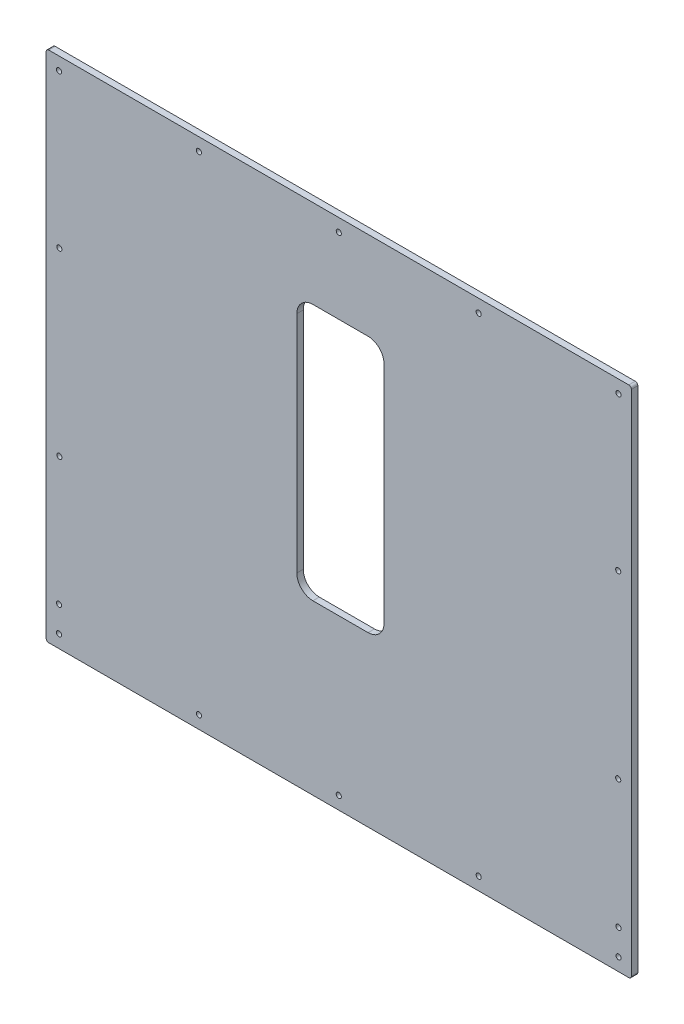
ISO-10303-21;
HEADER;
FILE_DESCRIPTION(('STEP AP214'),'2;1');
FILE_NAME('part.step','',(''),(''),'','','');
FILE_SCHEMA(('AUTOMOTIVE_DESIGN { 1 0 10303 214 1 1 1 1 }'));
ENDSEC;
DATA;
#1=APPLICATION_CONTEXT('core data for automotive mechanical design processes');
#2=APPLICATION_PROTOCOL_DEFINITION('international standard','automotive_design',2000,#1);
#3=PRODUCT_CONTEXT('',#1,'mechanical');
#4=PRODUCT('Part','Part','',(#3));
#5=PRODUCT_RELATED_PRODUCT_CATEGORY('part','',(#4));
#6=PRODUCT_DEFINITION_FORMATION('','',#4);
#7=PRODUCT_DEFINITION_CONTEXT('part definition',#1,'design');
#8=PRODUCT_DEFINITION('design','',#6,#7);
#9=PRODUCT_DEFINITION_SHAPE('','',#8);
#10=(LENGTH_UNIT() NAMED_UNIT(*) SI_UNIT(.MILLI.,.METRE.));
#11=(NAMED_UNIT(*) PLANE_ANGLE_UNIT() SI_UNIT($,.RADIAN.));
#12=(NAMED_UNIT(*) SI_UNIT($,.STERADIAN.) SOLID_ANGLE_UNIT());
#13=UNCERTAINTY_MEASURE_WITH_UNIT(LENGTH_MEASURE(1.E-05),#10,'distance_accuracy_value','');
#14=(GEOMETRIC_REPRESENTATION_CONTEXT(3) GLOBAL_UNCERTAINTY_ASSIGNED_CONTEXT((#13)) GLOBAL_UNIT_ASSIGNED_CONTEXT((#10,
#11,#12)) REPRESENTATION_CONTEXT('',''));
#15=CARTESIAN_POINT('',(0.,0.,0.));
#16=DIRECTION('',(0.,0.,1.));
#17=DIRECTION('',(1.,0.,0.));
#18=AXIS2_PLACEMENT_3D('',#15,#16,#17);
#19=CARTESIAN_POINT('',(-452.,396.,10.));
#20=DIRECTION('',(0.,0.,-1.));
#21=DIRECTION('',(-1.,0.,0.));
#22=AXIS2_PLACEMENT_3D('',#19,#20,#21);
#23=PLANE('',#22);
#24=DIRECTION('',(0.,-1.,0.));
#25=VECTOR('',#24,1.);
#26=CARTESIAN_POINT('',(-65.3796844061461,-112.501440844055,10.));
#27=LINE('',#26,#25);
#28=CARTESIAN_POINT('',(-65.3796844061461,237.498559155945,10.));
#29=VERTEX_POINT('',#28);
#30=CARTESIAN_POINT('',(-65.3796844061461,-112.501440844055,10.));
#31=VERTEX_POINT('',#30);
#32=EDGE_CURVE('E184',#29,#31,#27,.T.);
#33=ORIENTED_EDGE('',*,*,#32,.F.);
#34=CARTESIAN_POINT('',(-40.3796844061461,237.498559155945,10.));
#35=DIRECTION('',(0.,0.,1.));
#36=DIRECTION('',(1.,0.,0.));
#37=AXIS2_PLACEMENT_3D('',#34,#35,#36);
#38=CIRCLE('',#37,25.);
#39=CARTESIAN_POINT('',(-40.3796844061459,262.498559155945,10.));
#40=VERTEX_POINT('',#39);
#41=EDGE_CURVE('E47',#40,#29,#38,.T.);
#42=ORIENTED_EDGE('',*,*,#41,.F.);
#43=DIRECTION('',(-1.,0.,0.));
#44=VECTOR('',#43,1.);
#45=CARTESIAN_POINT('',(-40.3796844061459,262.498559155945,10.));
#46=LINE('',#45,#44);
#47=CARTESIAN_POINT('',(45.577215583192,262.498559155945,10.));
#48=VERTEX_POINT('',#47);
#49=EDGE_CURVE('E164',#48,#40,#46,.T.);
#50=ORIENTED_EDGE('',*,*,#49,.F.);
#51=CARTESIAN_POINT('',(45.5772155831922,237.498559155945,10.));
#52=DIRECTION('',(0.,0.,1.));
#53=DIRECTION('',(-1.,0.,0.));
#54=AXIS2_PLACEMENT_3D('',#51,#52,#53);
#55=CIRCLE('',#54,25.);
#56=CARTESIAN_POINT('',(70.5772155831922,237.498559155945,10.));
#57=VERTEX_POINT('',#56);
#58=EDGE_CURVE('E167',#57,#48,#55,.T.);
#59=ORIENTED_EDGE('',*,*,#58,.F.);
#60=DIRECTION('',(0.,1.,0.));
#61=VECTOR('',#60,1.);
#62=CARTESIAN_POINT('',(70.5772155831923,-112.501440844055,10.));
#63=LINE('',#62,#61);
#64=CARTESIAN_POINT('',(70.5772155831923,-112.501440844055,10.));
#65=VERTEX_POINT('',#64);
#66=EDGE_CURVE('E195',#65,#57,#63,.T.);
#67=ORIENTED_EDGE('',*,*,#66,.F.);
#68=CARTESIAN_POINT('',(45.5772155831923,-112.501440844055,10.));
#69=DIRECTION('',(0.,0.,1.));
#70=DIRECTION('',(-1.,0.,0.));
#71=AXIS2_PLACEMENT_3D('',#68,#69,#70);
#72=CIRCLE('',#71,25.);
#73=CARTESIAN_POINT('',(45.5772155831921,-137.501440844055,10.));
#74=VERTEX_POINT('',#73);
#75=EDGE_CURVE('E192',#74,#65,#72,.T.);
#76=ORIENTED_EDGE('',*,*,#75,.F.);
#77=DIRECTION('',(1.,0.,0.));
#78=VECTOR('',#77,1.);
#79=CARTESIAN_POINT('',(-40.3796844061459,-137.501440844055,10.));
#80=LINE('',#79,#78);
#81=CARTESIAN_POINT('',(-40.3796844061459,-137.501440844055,10.));
#82=VERTEX_POINT('',#81);
#83=EDGE_CURVE('E189',#82,#74,#80,.T.);
#84=ORIENTED_EDGE('',*,*,#83,.F.);
#85=CARTESIAN_POINT('',(-40.3796844061461,-112.501440844055,10.));
#86=DIRECTION('',(0.,0.,1.));
#87=DIRECTION('',(1.,0.,0.));
#88=AXIS2_PLACEMENT_3D('',#85,#86,#87);
#89=CIRCLE('',#88,25.);
#90=EDGE_CURVE('E186',#31,#82,#89,.T.);
#91=ORIENTED_EDGE('',*,*,#90,.F.);
#92=EDGE_LOOP('',(#33,#42,#50,#59,#67,#76,#84,#91));
#93=FACE_BOUND('',#92,.T.);
#94=CARTESIAN_POINT('',(-452.,396.,10.));
#95=DIRECTION('',(0.,0.,1.));
#96=DIRECTION('',(-1.,0.,0.));
#97=AXIS2_PLACEMENT_3D('',#94,#95,#96);
#98=CIRCLE('',#97,4.);
#99=CARTESIAN_POINT('',(-452.,400.,10.));
#100=VERTEX_POINT('',#99);
#101=CARTESIAN_POINT('',(-456.,396.,10.));
#102=VERTEX_POINT('',#101);
#103=EDGE_CURVE('E310',#100,#102,#98,.T.);
#104=ORIENTED_EDGE('',*,*,#103,.T.);
#105=DIRECTION('',(0.,-1.,0.));
#106=VECTOR('',#105,1.);
#107=CARTESIAN_POINT('',(-456.,-396.,10.));
#108=LINE('',#107,#106);
#109=CARTESIAN_POINT('',(-456.,-396.,10.));
#110=VERTEX_POINT('',#109);
#111=EDGE_CURVE('E313',#102,#110,#108,.T.);
#112=ORIENTED_EDGE('',*,*,#111,.T.);
#113=CARTESIAN_POINT('',(-452.,-396.,10.));
#114=DIRECTION('',(0.,0.,1.));
#115=DIRECTION('',(1.,0.,0.));
#116=AXIS2_PLACEMENT_3D('',#113,#114,#115);
#117=CIRCLE('',#116,4.);
#118=CARTESIAN_POINT('',(-452.,-400.,10.));
#119=VERTEX_POINT('',#118);
#120=EDGE_CURVE('E316',#110,#119,#117,.T.);
#121=ORIENTED_EDGE('',*,*,#120,.T.);
#122=DIRECTION('',(1.,0.,0.));
#123=VECTOR('',#122,1.);
#124=CARTESIAN_POINT('',(-452.,-400.,10.));
#125=LINE('',#124,#123);
#126=CARTESIAN_POINT('',(452.,-400.,10.));
#127=VERTEX_POINT('',#126);
#128=EDGE_CURVE('E318',#119,#127,#125,.T.);
#129=ORIENTED_EDGE('',*,*,#128,.T.);
#130=CARTESIAN_POINT('',(452.,-396.,10.));
#131=DIRECTION('',(0.,0.,1.));
#132=DIRECTION('',(1.,0.,0.));
#133=AXIS2_PLACEMENT_3D('',#130,#131,#132);
#134=CIRCLE('',#133,4.);
#135=CARTESIAN_POINT('',(456.,-396.,10.));
#136=VERTEX_POINT('',#135);
#137=EDGE_CURVE('E320',#127,#136,#134,.T.);
#138=ORIENTED_EDGE('',*,*,#137,.T.);
#139=DIRECTION('',(0.,1.,0.));
#140=VECTOR('',#139,1.);
#141=CARTESIAN_POINT('',(456.,-396.,10.));
#142=LINE('',#141,#140);
#143=CARTESIAN_POINT('',(456.,396.,10.));
#144=VERTEX_POINT('',#143);
#145=EDGE_CURVE('E322',#136,#144,#142,.T.);
#146=ORIENTED_EDGE('',*,*,#145,.T.);
#147=CARTESIAN_POINT('',(452.,396.,10.));
#148=DIRECTION('',(0.,0.,1.));
#149=DIRECTION('',(1.,0.,0.));
#150=AXIS2_PLACEMENT_3D('',#147,#148,#149);
#151=CIRCLE('',#150,4.);
#152=CARTESIAN_POINT('',(452.,400.,10.));
#153=VERTEX_POINT('',#152);
#154=EDGE_CURVE('E324',#144,#153,#151,.T.);
#155=ORIENTED_EDGE('',*,*,#154,.T.);
#156=DIRECTION('',(-1.,0.,0.));
#157=VECTOR('',#156,1.);
#158=CARTESIAN_POINT('',(-452.,400.,10.));
#159=LINE('',#158,#157);
#160=EDGE_CURVE('E326',#153,#100,#159,.T.);
#161=ORIENTED_EDGE('',*,*,#160,.T.);
#162=EDGE_LOOP('',(#104,#112,#121,#129,#138,#146,#155,#161));
#163=FACE_BOUND('',#162,.T.);
#164=CARTESIAN_POINT('',(436.,380.,10.));
#165=DIRECTION('',(0.,0.,1.));
#166=DIRECTION('',(1.,0.,0.));
#167=AXIS2_PLACEMENT_3D('',#164,#165,#166);
#168=CIRCLE('',#167,3.99999999999999);
#169=CARTESIAN_POINT('',(440.,380.,10.));
#170=VERTEX_POINT('',#169);
#171=EDGE_CURVE('E304',#170,#170,#168,.T.);
#172=ORIENTED_EDGE('',*,*,#171,.F.);
#173=EDGE_LOOP('',(#172));
#174=FACE_BOUND('',#173,.T.);
#175=CARTESIAN_POINT('',(435.5,141.,10.));
#176=DIRECTION('',(0.,0.,1.));
#177=DIRECTION('',(1.,0.,0.));
#178=AXIS2_PLACEMENT_3D('',#175,#176,#177);
#179=CIRCLE('',#178,3.99999999999999);
#180=CARTESIAN_POINT('',(439.5,141.,10.));
#181=VERTEX_POINT('',#180);
#182=EDGE_CURVE('E298',#181,#181,#179,.T.);
#183=ORIENTED_EDGE('',*,*,#182,.F.);
#184=EDGE_LOOP('',(#183));
#185=FACE_BOUND('',#184,.T.);
#186=CARTESIAN_POINT('',(435.500000000003,-140.,10.));
#187=DIRECTION('',(0.,0.,1.));
#188=DIRECTION('',(1.,0.,0.));
#189=AXIS2_PLACEMENT_3D('',#186,#187,#188);
#190=CIRCLE('',#189,3.99999999999999);
#191=CARTESIAN_POINT('',(439.500000000003,-140.,10.));
#192=VERTEX_POINT('',#191);
#193=EDGE_CURVE('E292',#192,#192,#190,.T.);
#194=ORIENTED_EDGE('',*,*,#193,.F.);
#195=EDGE_LOOP('',(#194));
#196=FACE_BOUND('',#195,.T.);
#197=CARTESIAN_POINT('',(-435.500000000003,-140.,10.));
#198=DIRECTION('',(0.,0.,1.));
#199=DIRECTION('',(-1.,0.,0.));
#200=AXIS2_PLACEMENT_3D('',#197,#198,#199);
#201=CIRCLE('',#200,3.99999999999999);
#202=CARTESIAN_POINT('',(-439.500000000003,-140.,10.));
#203=VERTEX_POINT('',#202);
#204=EDGE_CURVE('E286',#203,#203,#201,.T.);
#205=ORIENTED_EDGE('',*,*,#204,.F.);
#206=EDGE_LOOP('',(#205));
#207=FACE_BOUND('',#206,.T.);
#208=CARTESIAN_POINT('',(-436.,380.,10.));
#209=DIRECTION('',(0.,0.,1.));
#210=DIRECTION('',(-1.,0.,0.));
#211=AXIS2_PLACEMENT_3D('',#208,#209,#210);
#212=CIRCLE('',#211,3.99999999999999);
#213=CARTESIAN_POINT('',(-440.,380.,10.));
#214=VERTEX_POINT('',#213);
#215=EDGE_CURVE('E280',#214,#214,#212,.T.);
#216=ORIENTED_EDGE('',*,*,#215,.F.);
#217=EDGE_LOOP('',(#216));
#218=FACE_BOUND('',#217,.T.);
#219=CARTESIAN_POINT('',(-435.5,141.,10.));
#220=DIRECTION('',(0.,0.,1.));
#221=DIRECTION('',(-1.,0.,0.));
#222=AXIS2_PLACEMENT_3D('',#219,#220,#221);
#223=CIRCLE('',#222,3.99999999999999);
#224=CARTESIAN_POINT('',(-439.5,141.,10.));
#225=VERTEX_POINT('',#224);
#226=EDGE_CURVE('E274',#225,#225,#223,.T.);
#227=ORIENTED_EDGE('',*,*,#226,.F.);
#228=EDGE_LOOP('',(#227));
#229=FACE_BOUND('',#228,.T.);
#230=CARTESIAN_POINT('',(436.,-380.,10.));
#231=DIRECTION('',(0.,0.,1.));
#232=DIRECTION('',(-1.,0.,0.));
#233=AXIS2_PLACEMENT_3D('',#230,#231,#232);
#234=CIRCLE('',#233,3.99999999999999);
#235=CARTESIAN_POINT('',(432.,-380.,10.));
#236=VERTEX_POINT('',#235);
#237=EDGE_CURVE('E268',#236,#236,#234,.T.);
#238=ORIENTED_EDGE('',*,*,#237,.F.);
#239=EDGE_LOOP('',(#238));
#240=FACE_BOUND('',#239,.T.);
#241=CARTESIAN_POINT('',(436.,-340.,10.));
#242=DIRECTION('',(0.,0.,1.));
#243=DIRECTION('',(-1.,0.,0.));
#244=AXIS2_PLACEMENT_3D('',#241,#242,#243);
#245=CIRCLE('',#244,3.99999999999999);
#246=CARTESIAN_POINT('',(432.,-340.,10.));
#247=VERTEX_POINT('',#246);
#248=EDGE_CURVE('E262',#247,#247,#245,.T.);
#249=ORIENTED_EDGE('',*,*,#248,.F.);
#250=EDGE_LOOP('',(#249));
#251=FACE_BOUND('',#250,.T.);
#252=CARTESIAN_POINT('',(-435.999999999999,-340.,10.));
#253=DIRECTION('',(0.,0.,1.));
#254=DIRECTION('',(1.,0.,0.));
#255=AXIS2_PLACEMENT_3D('',#252,#253,#254);
#256=CIRCLE('',#255,3.99999999999999);
#257=CARTESIAN_POINT('',(-431.999999999999,-340.,10.));
#258=VERTEX_POINT('',#257);
#259=EDGE_CURVE('E256',#258,#258,#256,.T.);
#260=ORIENTED_EDGE('',*,*,#259,.F.);
#261=EDGE_LOOP('',(#260));
#262=FACE_BOUND('',#261,.T.);
#263=CARTESIAN_POINT('',(-435.999999999999,-380.,10.));
#264=DIRECTION('',(0.,0.,1.));
#265=DIRECTION('',(1.,0.,0.));
#266=AXIS2_PLACEMENT_3D('',#263,#264,#265);
#267=CIRCLE('',#266,3.99999999999999);
#268=CARTESIAN_POINT('',(-431.999999999999,-380.,10.));
#269=VERTEX_POINT('',#268);
#270=EDGE_CURVE('E250',#269,#269,#267,.T.);
#271=ORIENTED_EDGE('',*,*,#270,.F.);
#272=EDGE_LOOP('',(#271));
#273=FACE_BOUND('',#272,.T.);
#274=CARTESIAN_POINT('',(-218.,380.000000000005,10.));
#275=DIRECTION('',(0.,0.,1.));
#276=DIRECTION('',(1.,0.,0.));
#277=AXIS2_PLACEMENT_3D('',#274,#275,#276);
#278=CIRCLE('',#277,3.99999999999999);
#279=CARTESIAN_POINT('',(-214.,380.000000000005,10.));
#280=VERTEX_POINT('',#279);
#281=EDGE_CURVE('E244',#280,#280,#278,.T.);
#282=ORIENTED_EDGE('',*,*,#281,.F.);
#283=EDGE_LOOP('',(#282));
#284=FACE_BOUND('',#283,.T.);
#285=CARTESIAN_POINT('',(218.,-380.000000000002,10.));
#286=DIRECTION('',(0.,0.,1.));
#287=DIRECTION('',(-1.,0.,0.));
#288=AXIS2_PLACEMENT_3D('',#285,#286,#287);
#289=CIRCLE('',#288,3.99999999999999);
#290=CARTESIAN_POINT('',(214.,-380.000000000002,10.));
#291=VERTEX_POINT('',#290);
#292=EDGE_CURVE('E238',#291,#291,#289,.T.);
#293=ORIENTED_EDGE('',*,*,#292,.F.);
#294=EDGE_LOOP('',(#293));
#295=FACE_BOUND('',#294,.T.);
#296=CARTESIAN_POINT('',(-2.22044604925031E-13,-380.000000000003,10.));
#297=DIRECTION('',(0.,0.,1.));
#298=DIRECTION('',(-1.,0.,0.));
#299=AXIS2_PLACEMENT_3D('',#296,#297,#298);
#300=CIRCLE('',#299,3.99999999999999);
#301=CARTESIAN_POINT('',(-4.00000000000021,-380.000000000003,10.));
#302=VERTEX_POINT('',#301);
#303=EDGE_CURVE('E232',#302,#302,#300,.T.);
#304=ORIENTED_EDGE('',*,*,#303,.F.);
#305=EDGE_LOOP('',(#304));
#306=FACE_BOUND('',#305,.T.);
#307=CARTESIAN_POINT('',(-218.,-380.000000000005,10.));
#308=DIRECTION('',(0.,0.,1.));
#309=DIRECTION('',(-1.,0.,0.));
#310=AXIS2_PLACEMENT_3D('',#307,#308,#309);
#311=CIRCLE('',#310,3.99999999999999);
#312=CARTESIAN_POINT('',(-222.,-380.000000000005,10.));
#313=VERTEX_POINT('',#312);
#314=EDGE_CURVE('E226',#313,#313,#311,.T.);
#315=ORIENTED_EDGE('',*,*,#314,.F.);
#316=EDGE_LOOP('',(#315));
#317=FACE_BOUND('',#316,.T.);
#318=CARTESIAN_POINT('',(-4.44089209850063E-13,380.000000000003,10.));
#319=DIRECTION('',(0.,0.,1.));
#320=DIRECTION('',(1.,0.,0.));
#321=AXIS2_PLACEMENT_3D('',#318,#319,#320);
#322=CIRCLE('',#321,3.99999999999999);
#323=CARTESIAN_POINT('',(3.99999999999955,380.000000000003,10.));
#324=VERTEX_POINT('',#323);
#325=EDGE_CURVE('E220',#324,#324,#322,.T.);
#326=ORIENTED_EDGE('',*,*,#325,.F.);
#327=EDGE_LOOP('',(#326));
#328=FACE_BOUND('',#327,.T.);
#329=CARTESIAN_POINT('',(217.999999999999,380.000000000002,10.));
#330=DIRECTION('',(0.,0.,1.));
#331=DIRECTION('',(1.,0.,0.));
#332=AXIS2_PLACEMENT_3D('',#329,#330,#331);
#333=CIRCLE('',#332,3.99999999999999);
#334=CARTESIAN_POINT('',(221.999999999999,380.000000000002,10.));
#335=VERTEX_POINT('',#334);
#336=EDGE_CURVE('E214',#335,#335,#333,.T.);
#337=ORIENTED_EDGE('',*,*,#336,.F.);
#338=EDGE_LOOP('',(#337));
#339=FACE_BOUND('',#338,.T.);
#340=ADVANCED_FACE('F32',(#93,#163,#174,#185,#196,#207,#218,#229,#240,#251,#262,#273,#284,#295,
#306,#317,#328,#339),#23,.F.);
#341=CARTESIAN_POINT('',(-452.,396.,0.));
#342=DIRECTION('',(0.,0.,-1.));
#343=DIRECTION('',(-1.,0.,0.));
#344=AXIS2_PLACEMENT_3D('',#341,#342,#343);
#345=PLANE('',#344);
#346=CARTESIAN_POINT('',(-40.3796844061461,237.498559155945,0.));
#347=DIRECTION('',(0.,0.,1.));
#348=DIRECTION('',(1.,0.,0.));
#349=AXIS2_PLACEMENT_3D('',#346,#347,#348);
#350=CIRCLE('',#349,25.);
#351=CARTESIAN_POINT('',(-40.3796844061459,262.498559155945,0.));
#352=VERTEX_POINT('',#351);
#353=CARTESIAN_POINT('',(-65.3796844061461,237.498559155945,0.));
#354=VERTEX_POINT('',#353);
#355=EDGE_CURVE('E147',#352,#354,#350,.T.);
#356=ORIENTED_EDGE('',*,*,#355,.T.);
#357=DIRECTION('',(0.,-1.,0.));
#358=VECTOR('',#357,1.);
#359=CARTESIAN_POINT('',(-65.3796844061461,-112.501440844055,0.));
#360=LINE('',#359,#358);
#361=CARTESIAN_POINT('',(-65.3796844061461,-112.501440844055,0.));
#362=VERTEX_POINT('',#361);
#363=EDGE_CURVE('E156',#354,#362,#360,.T.);
#364=ORIENTED_EDGE('',*,*,#363,.T.);
#365=CARTESIAN_POINT('',(-40.3796844061461,-112.501440844055,0.));
#366=DIRECTION('',(0.,0.,1.));
#367=DIRECTION('',(1.,0.,0.));
#368=AXIS2_PLACEMENT_3D('',#365,#366,#367);
#369=CIRCLE('',#368,25.);
#370=CARTESIAN_POINT('',(-40.3796844061459,-137.501440844055,0.));
#371=VERTEX_POINT('',#370);
#372=EDGE_CURVE('E55',#362,#371,#369,.T.);
#373=ORIENTED_EDGE('',*,*,#372,.T.);
#374=DIRECTION('',(1.,0.,0.));
#375=VECTOR('',#374,1.);
#376=CARTESIAN_POINT('',(-40.3796844061459,-137.501440844055,0.));
#377=LINE('',#376,#375);
#378=CARTESIAN_POINT('',(45.5772155831921,-137.501440844055,0.));
#379=VERTEX_POINT('',#378);
#380=EDGE_CURVE('E171',#371,#379,#377,.T.);
#381=ORIENTED_EDGE('',*,*,#380,.T.);
#382=CARTESIAN_POINT('',(45.5772155831923,-112.501440844055,0.));
#383=DIRECTION('',(0.,0.,1.));
#384=DIRECTION('',(-1.,0.,0.));
#385=AXIS2_PLACEMENT_3D('',#382,#383,#384);
#386=CIRCLE('',#385,25.);
#387=CARTESIAN_POINT('',(70.5772155831923,-112.501440844055,0.));
#388=VERTEX_POINT('',#387);
#389=EDGE_CURVE('E174',#379,#388,#386,.T.);
#390=ORIENTED_EDGE('',*,*,#389,.T.);
#391=DIRECTION('',(0.,1.,0.));
#392=VECTOR('',#391,1.);
#393=CARTESIAN_POINT('',(70.5772155831923,-112.501440844055,0.));
#394=LINE('',#393,#392);
#395=CARTESIAN_POINT('',(70.5772155831922,237.498559155945,0.));
#396=VERTEX_POINT('',#395);
#397=EDGE_CURVE('E177',#388,#396,#394,.T.);
#398=ORIENTED_EDGE('',*,*,#397,.T.);
#399=CARTESIAN_POINT('',(45.5772155831922,237.498559155945,0.));
#400=DIRECTION('',(0.,0.,1.));
#401=DIRECTION('',(-1.,0.,0.));
#402=AXIS2_PLACEMENT_3D('',#399,#400,#401);
#403=CIRCLE('',#402,25.);
#404=CARTESIAN_POINT('',(45.577215583192,262.498559155945,0.));
#405=VERTEX_POINT('',#404);
#406=EDGE_CURVE('E180',#396,#405,#403,.T.);
#407=ORIENTED_EDGE('',*,*,#406,.T.);
#408=DIRECTION('',(-1.,0.,0.));
#409=VECTOR('',#408,1.);
#410=CARTESIAN_POINT('',(-40.3796844061459,262.498559155945,0.));
#411=LINE('',#410,#409);
#412=EDGE_CURVE('E153',#405,#352,#411,.T.);
#413=ORIENTED_EDGE('',*,*,#412,.T.);
#414=EDGE_LOOP('',(#356,#364,#373,#381,#390,#398,#407,#413));
#415=FACE_BOUND('',#414,.T.);
#416=CARTESIAN_POINT('',(-4.44089209850063E-13,380.000000000003,0.));
#417=DIRECTION('',(0.,0.,1.));
#418=DIRECTION('',(1.,0.,0.));
#419=AXIS2_PLACEMENT_3D('',#416,#417,#418);
#420=CIRCLE('',#419,3.99999999999999);
#421=CARTESIAN_POINT('',(3.99999999999955,380.000000000003,0.));
#422=VERTEX_POINT('',#421);
#423=EDGE_CURVE('E217',#422,#422,#420,.T.);
#424=ORIENTED_EDGE('',*,*,#423,.T.);
#425=EDGE_LOOP('',(#424));
#426=FACE_BOUND('',#425,.T.);
#427=CARTESIAN_POINT('',(-2.22044604925031E-13,-380.000000000003,0.));
#428=DIRECTION('',(0.,0.,1.));
#429=DIRECTION('',(-1.,0.,0.));
#430=AXIS2_PLACEMENT_3D('',#427,#428,#429);
#431=CIRCLE('',#430,3.99999999999999);
#432=CARTESIAN_POINT('',(-4.00000000000021,-380.000000000003,0.));
#433=VERTEX_POINT('',#432);
#434=EDGE_CURVE('E229',#433,#433,#431,.T.);
#435=ORIENTED_EDGE('',*,*,#434,.T.);
#436=EDGE_LOOP('',(#435));
#437=FACE_BOUND('',#436,.T.);
#438=CARTESIAN_POINT('',(-218.,380.000000000005,0.));
#439=DIRECTION('',(0.,0.,1.));
#440=DIRECTION('',(1.,0.,0.));
#441=AXIS2_PLACEMENT_3D('',#438,#439,#440);
#442=CIRCLE('',#441,3.99999999999999);
#443=CARTESIAN_POINT('',(-214.,380.000000000005,0.));
#444=VERTEX_POINT('',#443);
#445=EDGE_CURVE('E241',#444,#444,#442,.T.);
#446=ORIENTED_EDGE('',*,*,#445,.T.);
#447=EDGE_LOOP('',(#446));
#448=FACE_BOUND('',#447,.T.);
#449=CARTESIAN_POINT('',(-435.999999999999,-340.,0.));
#450=DIRECTION('',(0.,0.,1.));
#451=DIRECTION('',(1.,0.,0.));
#452=AXIS2_PLACEMENT_3D('',#449,#450,#451);
#453=CIRCLE('',#452,3.99999999999999);
#454=CARTESIAN_POINT('',(-431.999999999999,-340.,0.));
#455=VERTEX_POINT('',#454);
#456=EDGE_CURVE('E253',#455,#455,#453,.T.);
#457=ORIENTED_EDGE('',*,*,#456,.T.);
#458=EDGE_LOOP('',(#457));
#459=FACE_BOUND('',#458,.T.);
#460=CARTESIAN_POINT('',(436.,-380.,0.));
#461=DIRECTION('',(0.,0.,1.));
#462=DIRECTION('',(-1.,0.,0.));
#463=AXIS2_PLACEMENT_3D('',#460,#461,#462);
#464=CIRCLE('',#463,3.99999999999999);
#465=CARTESIAN_POINT('',(432.,-380.,0.));
#466=VERTEX_POINT('',#465);
#467=EDGE_CURVE('E265',#466,#466,#464,.T.);
#468=ORIENTED_EDGE('',*,*,#467,.T.);
#469=EDGE_LOOP('',(#468));
#470=FACE_BOUND('',#469,.T.);
#471=CARTESIAN_POINT('',(-436.,380.,0.));
#472=DIRECTION('',(0.,0.,1.));
#473=DIRECTION('',(-1.,0.,0.));
#474=AXIS2_PLACEMENT_3D('',#471,#472,#473);
#475=CIRCLE('',#474,3.99999999999999);
#476=CARTESIAN_POINT('',(-440.,380.,0.));
#477=VERTEX_POINT('',#476);
#478=EDGE_CURVE('E277',#477,#477,#475,.T.);
#479=ORIENTED_EDGE('',*,*,#478,.T.);
#480=EDGE_LOOP('',(#479));
#481=FACE_BOUND('',#480,.T.);
#482=CARTESIAN_POINT('',(435.500000000003,-140.,0.));
#483=DIRECTION('',(0.,0.,1.));
#484=DIRECTION('',(1.,0.,0.));
#485=AXIS2_PLACEMENT_3D('',#482,#483,#484);
#486=CIRCLE('',#485,3.99999999999999);
#487=CARTESIAN_POINT('',(439.500000000003,-140.,0.));
#488=VERTEX_POINT('',#487);
#489=EDGE_CURVE('E289',#488,#488,#486,.T.);
#490=ORIENTED_EDGE('',*,*,#489,.T.);
#491=EDGE_LOOP('',(#490));
#492=FACE_BOUND('',#491,.T.);
#493=CARTESIAN_POINT('',(436.,380.,0.));
#494=DIRECTION('',(0.,0.,1.));
#495=DIRECTION('',(1.,0.,0.));
#496=AXIS2_PLACEMENT_3D('',#493,#494,#495);
#497=CIRCLE('',#496,3.99999999999999);
#498=CARTESIAN_POINT('',(440.,380.,0.));
#499=VERTEX_POINT('',#498);
#500=EDGE_CURVE('E301',#499,#499,#497,.T.);
#501=ORIENTED_EDGE('',*,*,#500,.T.);
#502=EDGE_LOOP('',(#501));
#503=FACE_BOUND('',#502,.T.);
#504=CARTESIAN_POINT('',(-452.,396.,0.));
#505=DIRECTION('',(0.,0.,1.));
#506=DIRECTION('',(-1.,0.,0.));
#507=AXIS2_PLACEMENT_3D('',#504,#505,#506);
#508=CIRCLE('',#507,4.);
#509=CARTESIAN_POINT('',(-452.,400.,0.));
#510=VERTEX_POINT('',#509);
#511=CARTESIAN_POINT('',(-456.,396.,0.));
#512=VERTEX_POINT('',#511);
#513=EDGE_CURVE('E307',#510,#512,#508,.T.);
#514=ORIENTED_EDGE('',*,*,#513,.F.);
#515=DIRECTION('',(-1.,0.,0.));
#516=VECTOR('',#515,1.);
#517=CARTESIAN_POINT('',(-452.,400.,0.));
#518=LINE('',#517,#516);
#519=CARTESIAN_POINT('',(452.,400.,0.));
#520=VERTEX_POINT('',#519);
#521=EDGE_CURVE('E314',#520,#510,#518,.T.);
#522=ORIENTED_EDGE('',*,*,#521,.F.);
#523=CARTESIAN_POINT('',(452.,396.,0.));
#524=DIRECTION('',(0.,0.,1.));
#525=DIRECTION('',(1.,0.,0.));
#526=AXIS2_PLACEMENT_3D('',#523,#524,#525);
#527=CIRCLE('',#526,4.);
#528=CARTESIAN_POINT('',(456.,396.,0.));
#529=VERTEX_POINT('',#528);
#530=EDGE_CURVE('E341',#529,#520,#527,.T.);
#531=ORIENTED_EDGE('',*,*,#530,.F.);
#532=DIRECTION('',(0.,1.,0.));
#533=VECTOR('',#532,1.);
#534=CARTESIAN_POINT('',(456.,-396.,0.));
#535=LINE('',#534,#533);
#536=CARTESIAN_POINT('',(456.,-396.,0.));
#537=VERTEX_POINT('',#536);
#538=EDGE_CURVE('E339',#537,#529,#535,.T.);
#539=ORIENTED_EDGE('',*,*,#538,.F.);
#540=CARTESIAN_POINT('',(452.,-396.,0.));
#541=DIRECTION('',(0.,0.,1.));
#542=DIRECTION('',(1.,0.,0.));
#543=AXIS2_PLACEMENT_3D('',#540,#541,#542);
#544=CIRCLE('',#543,4.);
#545=CARTESIAN_POINT('',(452.,-400.,0.));
#546=VERTEX_POINT('',#545);
#547=EDGE_CURVE('E337',#546,#537,#544,.T.);
#548=ORIENTED_EDGE('',*,*,#547,.F.);
#549=DIRECTION('',(1.,0.,0.));
#550=VECTOR('',#549,1.);
#551=CARTESIAN_POINT('',(-452.,-400.,0.));
#552=LINE('',#551,#550);
#553=CARTESIAN_POINT('',(-452.,-400.,0.));
#554=VERTEX_POINT('',#553);
#555=EDGE_CURVE('E335',#554,#546,#552,.T.);
#556=ORIENTED_EDGE('',*,*,#555,.F.);
#557=CARTESIAN_POINT('',(-452.,-396.,0.));
#558=DIRECTION('',(0.,0.,1.));
#559=DIRECTION('',(1.,0.,0.));
#560=AXIS2_PLACEMENT_3D('',#557,#558,#559);
#561=CIRCLE('',#560,4.);
#562=CARTESIAN_POINT('',(-456.,-396.,0.));
#563=VERTEX_POINT('',#562);
#564=EDGE_CURVE('E333',#563,#554,#561,.T.);
#565=ORIENTED_EDGE('',*,*,#564,.F.);
#566=DIRECTION('',(0.,-1.,0.));
#567=VECTOR('',#566,1.);
#568=CARTESIAN_POINT('',(-456.,-396.,0.));
#569=LINE('',#568,#567);
#570=EDGE_CURVE('E331',#512,#563,#569,.T.);
#571=ORIENTED_EDGE('',*,*,#570,.F.);
#572=EDGE_LOOP('',(#514,#522,#531,#539,#548,#556,#565,#571));
#573=FACE_BOUND('',#572,.T.);
#574=CARTESIAN_POINT('',(435.5,141.,0.));
#575=DIRECTION('',(0.,0.,1.));
#576=DIRECTION('',(1.,0.,0.));
#577=AXIS2_PLACEMENT_3D('',#574,#575,#576);
#578=CIRCLE('',#577,3.99999999999999);
#579=CARTESIAN_POINT('',(439.5,141.,0.));
#580=VERTEX_POINT('',#579);
#581=EDGE_CURVE('E295',#580,#580,#578,.T.);
#582=ORIENTED_EDGE('',*,*,#581,.T.);
#583=EDGE_LOOP('',(#582));
#584=FACE_BOUND('',#583,.T.);
#585=CARTESIAN_POINT('',(-435.500000000003,-140.,0.));
#586=DIRECTION('',(0.,0.,1.));
#587=DIRECTION('',(-1.,0.,0.));
#588=AXIS2_PLACEMENT_3D('',#585,#586,#587);
#589=CIRCLE('',#588,3.99999999999999);
#590=CARTESIAN_POINT('',(-439.500000000003,-140.,0.));
#591=VERTEX_POINT('',#590);
#592=EDGE_CURVE('E283',#591,#591,#589,.T.);
#593=ORIENTED_EDGE('',*,*,#592,.T.);
#594=EDGE_LOOP('',(#593));
#595=FACE_BOUND('',#594,.T.);
#596=CARTESIAN_POINT('',(-435.5,141.,0.));
#597=DIRECTION('',(0.,0.,1.));
#598=DIRECTION('',(-1.,0.,0.));
#599=AXIS2_PLACEMENT_3D('',#596,#597,#598);
#600=CIRCLE('',#599,3.99999999999999);
#601=CARTESIAN_POINT('',(-439.5,141.,0.));
#602=VERTEX_POINT('',#601);
#603=EDGE_CURVE('E271',#602,#602,#600,.T.);
#604=ORIENTED_EDGE('',*,*,#603,.T.);
#605=EDGE_LOOP('',(#604));
#606=FACE_BOUND('',#605,.T.);
#607=CARTESIAN_POINT('',(436.,-340.,0.));
#608=DIRECTION('',(0.,0.,1.));
#609=DIRECTION('',(-1.,0.,0.));
#610=AXIS2_PLACEMENT_3D('',#607,#608,#609);
#611=CIRCLE('',#610,3.99999999999999);
#612=CARTESIAN_POINT('',(432.,-340.,0.));
#613=VERTEX_POINT('',#612);
#614=EDGE_CURVE('E259',#613,#613,#611,.T.);
#615=ORIENTED_EDGE('',*,*,#614,.T.);
#616=EDGE_LOOP('',(#615));
#617=FACE_BOUND('',#616,.T.);
#618=CARTESIAN_POINT('',(-435.999999999999,-380.,0.));
#619=DIRECTION('',(0.,0.,1.));
#620=DIRECTION('',(1.,0.,0.));
#621=AXIS2_PLACEMENT_3D('',#618,#619,#620);
#622=CIRCLE('',#621,3.99999999999999);
#623=CARTESIAN_POINT('',(-431.999999999999,-380.,0.));
#624=VERTEX_POINT('',#623);
#625=EDGE_CURVE('E247',#624,#624,#622,.T.);
#626=ORIENTED_EDGE('',*,*,#625,.T.);
#627=EDGE_LOOP('',(#626));
#628=FACE_BOUND('',#627,.T.);
#629=CARTESIAN_POINT('',(218.,-380.000000000002,0.));
#630=DIRECTION('',(0.,0.,1.));
#631=DIRECTION('',(-1.,0.,0.));
#632=AXIS2_PLACEMENT_3D('',#629,#630,#631);
#633=CIRCLE('',#632,3.99999999999999);
#634=CARTESIAN_POINT('',(214.,-380.000000000002,0.));
#635=VERTEX_POINT('',#634);
#636=EDGE_CURVE('E235',#635,#635,#633,.T.);
#637=ORIENTED_EDGE('',*,*,#636,.T.);
#638=EDGE_LOOP('',(#637));
#639=FACE_BOUND('',#638,.T.);
#640=CARTESIAN_POINT('',(-218.,-380.000000000005,0.));
#641=DIRECTION('',(0.,0.,1.));
#642=DIRECTION('',(-1.,0.,0.));
#643=AXIS2_PLACEMENT_3D('',#640,#641,#642);
#644=CIRCLE('',#643,3.99999999999999);
#645=CARTESIAN_POINT('',(-222.,-380.000000000005,0.));
#646=VERTEX_POINT('',#645);
#647=EDGE_CURVE('E223',#646,#646,#644,.T.);
#648=ORIENTED_EDGE('',*,*,#647,.T.);
#649=EDGE_LOOP('',(#648));
#650=FACE_BOUND('',#649,.T.);
#651=CARTESIAN_POINT('',(217.999999999999,380.000000000002,0.));
#652=DIRECTION('',(0.,0.,1.));
#653=DIRECTION('',(1.,0.,0.));
#654=AXIS2_PLACEMENT_3D('',#651,#652,#653);
#655=CIRCLE('',#654,3.99999999999999);
#656=CARTESIAN_POINT('',(221.999999999999,380.000000000002,0.));
#657=VERTEX_POINT('',#656);
#658=EDGE_CURVE('E202',#657,#657,#655,.T.);
#659=ORIENTED_EDGE('',*,*,#658,.T.);
#660=EDGE_LOOP('',(#659));
#661=FACE_BOUND('',#660,.T.);
#662=ADVANCED_FACE('F160',(#415,#426,#437,#448,#459,#470,#481,#492,#503,#573,#584,#595,#606,
#617,#628,#639,#650,#661),#345,.T.);
#663=CARTESIAN_POINT('',(-452.,396.,10.));
#664=DIRECTION('',(0.,0.,-1.));
#665=DIRECTION('',(-1.,0.,0.));
#666=AXIS2_PLACEMENT_3D('',#663,#664,#665);
#667=CYLINDRICAL_SURFACE('',#666,4.);
#668=ORIENTED_EDGE('',*,*,#513,.T.);
#669=DIRECTION('',(0.,0.,-1.));
#670=VECTOR('',#669,1.);
#671=CARTESIAN_POINT('',(-456.,396.,10.));
#672=LINE('',#671,#670);
#673=EDGE_CURVE('E11',#102,#512,#672,.T.);
#674=ORIENTED_EDGE('',*,*,#673,.F.);
#675=ORIENTED_EDGE('',*,*,#103,.F.);
#676=DIRECTION('',(0.,0.,-1.));
#677=VECTOR('',#676,1.);
#678=CARTESIAN_POINT('',(-452.,400.,10.));
#679=LINE('',#678,#677);
#680=EDGE_CURVE('E328',#100,#510,#679,.T.);
#681=ORIENTED_EDGE('',*,*,#680,.T.);
#682=EDGE_LOOP('',(#668,#674,#675,#681));
#683=FACE_BOUND('',#682,.T.);
#684=ADVANCED_FACE('F34',(#683),#667,.T.);
#685=CARTESIAN_POINT('',(-456.,-396.,10.));
#686=DIRECTION('',(1.,0.,0.));
#687=DIRECTION('',(0.,0.,-1.));
#688=AXIS2_PLACEMENT_3D('',#685,#686,#687);
#689=PLANE('',#688);
#690=ORIENTED_EDGE('',*,*,#570,.T.);
#691=DIRECTION('',(0.,0.,-1.));
#692=VECTOR('',#691,1.);
#693=CARTESIAN_POINT('',(-456.,-396.,10.));
#694=LINE('',#693,#692);
#695=EDGE_CURVE('E40',#110,#563,#694,.T.);
#696=ORIENTED_EDGE('',*,*,#695,.F.);
#697=ORIENTED_EDGE('',*,*,#111,.F.);
#698=ORIENTED_EDGE('',*,*,#673,.T.);
#699=EDGE_LOOP('',(#690,#696,#697,#698));
#700=FACE_BOUND('',#699,.T.);
#701=ADVANCED_FACE('F388',(#700),#689,.F.);
#702=CARTESIAN_POINT('',(-452.,-396.,10.));
#703=DIRECTION('',(0.,0.,-1.));
#704=DIRECTION('',(-1.,0.,0.));
#705=AXIS2_PLACEMENT_3D('',#702,#703,#704);
#706=CYLINDRICAL_SURFACE('',#705,4.);
#707=ORIENTED_EDGE('',*,*,#564,.T.);
#708=DIRECTION('',(0.,0.,-1.));
#709=VECTOR('',#708,1.);
#710=CARTESIAN_POINT('',(-452.,-400.,10.));
#711=LINE('',#710,#709);
#712=EDGE_CURVE('E358',#119,#554,#711,.T.);
#713=ORIENTED_EDGE('',*,*,#712,.F.);
#714=ORIENTED_EDGE('',*,*,#120,.F.);
#715=ORIENTED_EDGE('',*,*,#695,.T.);
#716=EDGE_LOOP('',(#707,#713,#714,#715));
#717=FACE_BOUND('',#716,.T.);
#718=ADVANCED_FACE('F365',(#717),#706,.T.);
#719=CARTESIAN_POINT('',(-452.,-400.,10.));
#720=DIRECTION('',(0.,1.,0.));
#721=DIRECTION('',(0.,0.,1.));
#722=AXIS2_PLACEMENT_3D('',#719,#720,#721);
#723=PLANE('',#722);
#724=ORIENTED_EDGE('',*,*,#555,.T.);
#725=DIRECTION('',(0.,0.,-1.));
#726=VECTOR('',#725,1.);
#727=CARTESIAN_POINT('',(452.,-400.,10.));
#728=LINE('',#727,#726);
#729=EDGE_CURVE('E355',#127,#546,#728,.T.);
#730=ORIENTED_EDGE('',*,*,#729,.F.);
#731=ORIENTED_EDGE('',*,*,#128,.F.);
#732=ORIENTED_EDGE('',*,*,#712,.T.);
#733=EDGE_LOOP('',(#724,#730,#731,#732));
#734=FACE_BOUND('',#733,.T.);
#735=ADVANCED_FACE('F376',(#734),#723,.F.);
#736=CARTESIAN_POINT('',(452.,-396.,10.));
#737=DIRECTION('',(0.,0.,-1.));
#738=DIRECTION('',(-1.,0.,0.));
#739=AXIS2_PLACEMENT_3D('',#736,#737,#738);
#740=CYLINDRICAL_SURFACE('',#739,4.);
#741=ORIENTED_EDGE('',*,*,#547,.T.);
#742=DIRECTION('',(0.,0.,-1.));
#743=VECTOR('',#742,1.);
#744=CARTESIAN_POINT('',(456.,-396.,10.));
#745=LINE('',#744,#743);
#746=EDGE_CURVE('E352',#136,#537,#745,.T.);
#747=ORIENTED_EDGE('',*,*,#746,.F.);
#748=ORIENTED_EDGE('',*,*,#137,.F.);
#749=ORIENTED_EDGE('',*,*,#729,.T.);
#750=EDGE_LOOP('',(#741,#747,#748,#749));
#751=FACE_BOUND('',#750,.T.);
#752=ADVANCED_FACE('F380',(#751),#740,.T.);
#753=CARTESIAN_POINT('',(456.,-396.,10.));
#754=DIRECTION('',(-1.,0.,0.));
#755=DIRECTION('',(0.,0.,1.));
#756=AXIS2_PLACEMENT_3D('',#753,#754,#755);
#757=PLANE('',#756);
#758=ORIENTED_EDGE('',*,*,#538,.T.);
#759=DIRECTION('',(0.,0.,-1.));
#760=VECTOR('',#759,1.);
#761=CARTESIAN_POINT('',(456.,396.,10.));
#762=LINE('',#761,#760);
#763=EDGE_CURVE('E349',#144,#529,#762,.T.);
#764=ORIENTED_EDGE('',*,*,#763,.F.);
#765=ORIENTED_EDGE('',*,*,#145,.F.);
#766=ORIENTED_EDGE('',*,*,#746,.T.);
#767=EDGE_LOOP('',(#758,#764,#765,#766));
#768=FACE_BOUND('',#767,.T.);
#769=ADVANCED_FACE('F401',(#768),#757,.F.);
#770=CARTESIAN_POINT('',(452.,396.,10.));
#771=DIRECTION('',(0.,0.,-1.));
#772=DIRECTION('',(-1.,0.,0.));
#773=AXIS2_PLACEMENT_3D('',#770,#771,#772);
#774=CYLINDRICAL_SURFACE('',#773,4.);
#775=ORIENTED_EDGE('',*,*,#530,.T.);
#776=DIRECTION('',(0.,0.,-1.));
#777=VECTOR('',#776,1.);
#778=CARTESIAN_POINT('',(452.,400.,10.));
#779=LINE('',#778,#777);
#780=EDGE_CURVE('E346',#153,#520,#779,.T.);
#781=ORIENTED_EDGE('',*,*,#780,.F.);
#782=ORIENTED_EDGE('',*,*,#154,.F.);
#783=ORIENTED_EDGE('',*,*,#763,.T.);
#784=EDGE_LOOP('',(#775,#781,#782,#783));
#785=FACE_BOUND('',#784,.T.);
#786=ADVANCED_FACE('F399',(#785),#774,.T.);
#787=CARTESIAN_POINT('',(-452.,400.,10.));
#788=DIRECTION('',(0.,-1.,0.));
#789=DIRECTION('',(0.,0.,-1.));
#790=AXIS2_PLACEMENT_3D('',#787,#788,#789);
#791=PLANE('',#790);
#792=ORIENTED_EDGE('',*,*,#521,.T.);
#793=ORIENTED_EDGE('',*,*,#680,.F.);
#794=ORIENTED_EDGE('',*,*,#160,.F.);
#795=ORIENTED_EDGE('',*,*,#780,.T.);
#796=EDGE_LOOP('',(#792,#793,#794,#795));
#797=FACE_BOUND('',#796,.T.);
#798=ADVANCED_FACE('F394',(#797),#791,.F.);
#799=CARTESIAN_POINT('',(436.,380.,10.));
#800=DIRECTION('',(0.,0.,-1.));
#801=DIRECTION('',(-1.,0.,0.));
#802=AXIS2_PLACEMENT_3D('',#799,#800,#801);
#803=CYLINDRICAL_SURFACE('',#802,3.99999999999999);
#804=ORIENTED_EDGE('',*,*,#171,.T.);
#805=EDGE_LOOP('',(#804));
#806=FACE_BOUND('',#805,.T.);
#807=ORIENTED_EDGE('',*,*,#500,.F.);
#808=EDGE_LOOP('',(#807));
#809=FACE_BOUND('',#808,.T.);
#810=ADVANCED_FACE('F418',(#806,#809),#803,.F.);
#811=CARTESIAN_POINT('',(435.5,141.,10.));
#812=DIRECTION('',(0.,0.,-1.));
#813=DIRECTION('',(-1.,0.,0.));
#814=AXIS2_PLACEMENT_3D('',#811,#812,#813);
#815=CYLINDRICAL_SURFACE('',#814,3.99999999999999);
#816=ORIENTED_EDGE('',*,*,#182,.T.);
#817=EDGE_LOOP('',(#816));
#818=FACE_BOUND('',#817,.T.);
#819=ORIENTED_EDGE('',*,*,#581,.F.);
#820=EDGE_LOOP('',(#819));
#821=FACE_BOUND('',#820,.T.);
#822=ADVANCED_FACE('F425',(#818,#821),#815,.F.);
#823=CARTESIAN_POINT('',(435.500000000003,-140.,10.));
#824=DIRECTION('',(0.,0.,-1.));
#825=DIRECTION('',(-1.,0.,0.));
#826=AXIS2_PLACEMENT_3D('',#823,#824,#825);
#827=CYLINDRICAL_SURFACE('',#826,3.99999999999999);
#828=ORIENTED_EDGE('',*,*,#193,.T.);
#829=EDGE_LOOP('',(#828));
#830=FACE_BOUND('',#829,.T.);
#831=ORIENTED_EDGE('',*,*,#489,.F.);
#832=EDGE_LOOP('',(#831));
#833=FACE_BOUND('',#832,.T.);
#834=ADVANCED_FACE('F430',(#830,#833),#827,.F.);
#835=CARTESIAN_POINT('',(-435.500000000003,-140.,10.));
#836=DIRECTION('',(0.,0.,-1.));
#837=DIRECTION('',(-1.,0.,0.));
#838=AXIS2_PLACEMENT_3D('',#835,#836,#837);
#839=CYLINDRICAL_SURFACE('',#838,3.99999999999999);
#840=ORIENTED_EDGE('',*,*,#204,.T.);
#841=EDGE_LOOP('',(#840));
#842=FACE_BOUND('',#841,.T.);
#843=ORIENTED_EDGE('',*,*,#592,.F.);
#844=EDGE_LOOP('',(#843));
#845=FACE_BOUND('',#844,.T.);
#846=ADVANCED_FACE('F523',(#842,#845),#839,.F.);
#847=CARTESIAN_POINT('',(-436.,380.,10.));
#848=DIRECTION('',(0.,0.,-1.));
#849=DIRECTION('',(-1.,0.,0.));
#850=AXIS2_PLACEMENT_3D('',#847,#848,#849);
#851=CYLINDRICAL_SURFACE('',#850,3.99999999999999);
#852=ORIENTED_EDGE('',*,*,#215,.T.);
#853=EDGE_LOOP('',(#852));
#854=FACE_BOUND('',#853,.T.);
#855=ORIENTED_EDGE('',*,*,#478,.F.);
#856=EDGE_LOOP('',(#855));
#857=FACE_BOUND('',#856,.T.);
#858=ADVANCED_FACE('F519',(#854,#857),#851,.F.);
#859=CARTESIAN_POINT('',(-435.5,141.,10.));
#860=DIRECTION('',(0.,0.,-1.));
#861=DIRECTION('',(-1.,0.,0.));
#862=AXIS2_PLACEMENT_3D('',#859,#860,#861);
#863=CYLINDRICAL_SURFACE('',#862,3.99999999999999);
#864=ORIENTED_EDGE('',*,*,#226,.T.);
#865=EDGE_LOOP('',(#864));
#866=FACE_BOUND('',#865,.T.);
#867=ORIENTED_EDGE('',*,*,#603,.F.);
#868=EDGE_LOOP('',(#867));
#869=FACE_BOUND('',#868,.T.);
#870=ADVANCED_FACE('F515',(#866,#869),#863,.F.);
#871=CARTESIAN_POINT('',(436.,-380.,10.));
#872=DIRECTION('',(0.,0.,-1.));
#873=DIRECTION('',(-1.,0.,0.));
#874=AXIS2_PLACEMENT_3D('',#871,#872,#873);
#875=CYLINDRICAL_SURFACE('',#874,3.99999999999999);
#876=ORIENTED_EDGE('',*,*,#237,.T.);
#877=EDGE_LOOP('',(#876));
#878=FACE_BOUND('',#877,.T.);
#879=ORIENTED_EDGE('',*,*,#467,.F.);
#880=EDGE_LOOP('',(#879));
#881=FACE_BOUND('',#880,.T.);
#882=ADVANCED_FACE('F511',(#878,#881),#875,.F.);
#883=CARTESIAN_POINT('',(436.,-340.,10.));
#884=DIRECTION('',(0.,0.,-1.));
#885=DIRECTION('',(-1.,0.,0.));
#886=AXIS2_PLACEMENT_3D('',#883,#884,#885);
#887=CYLINDRICAL_SURFACE('',#886,3.99999999999999);
#888=ORIENTED_EDGE('',*,*,#248,.T.);
#889=EDGE_LOOP('',(#888));
#890=FACE_BOUND('',#889,.T.);
#891=ORIENTED_EDGE('',*,*,#614,.F.);
#892=EDGE_LOOP('',(#891));
#893=FACE_BOUND('',#892,.T.);
#894=ADVANCED_FACE('F507',(#890,#893),#887,.F.);
#895=CARTESIAN_POINT('',(-435.999999999999,-340.,10.));
#896=DIRECTION('',(0.,0.,-1.));
#897=DIRECTION('',(-1.,0.,0.));
#898=AXIS2_PLACEMENT_3D('',#895,#896,#897);
#899=CYLINDRICAL_SURFACE('',#898,3.99999999999999);
#900=ORIENTED_EDGE('',*,*,#259,.T.);
#901=EDGE_LOOP('',(#900));
#902=FACE_BOUND('',#901,.T.);
#903=ORIENTED_EDGE('',*,*,#456,.F.);
#904=EDGE_LOOP('',(#903));
#905=FACE_BOUND('',#904,.T.);
#906=ADVANCED_FACE('F503',(#902,#905),#899,.F.);
#907=CARTESIAN_POINT('',(-435.999999999999,-380.,10.));
#908=DIRECTION('',(0.,0.,-1.));
#909=DIRECTION('',(-1.,0.,0.));
#910=AXIS2_PLACEMENT_3D('',#907,#908,#909);
#911=CYLINDRICAL_SURFACE('',#910,3.99999999999999);
#912=ORIENTED_EDGE('',*,*,#270,.T.);
#913=EDGE_LOOP('',(#912));
#914=FACE_BOUND('',#913,.T.);
#915=ORIENTED_EDGE('',*,*,#625,.F.);
#916=EDGE_LOOP('',(#915));
#917=FACE_BOUND('',#916,.T.);
#918=ADVANCED_FACE('F499',(#914,#917),#911,.F.);
#919=CARTESIAN_POINT('',(-218.,380.000000000005,10.));
#920=DIRECTION('',(0.,0.,-1.));
#921=DIRECTION('',(-1.,0.,0.));
#922=AXIS2_PLACEMENT_3D('',#919,#920,#921);
#923=CYLINDRICAL_SURFACE('',#922,3.99999999999999);
#924=ORIENTED_EDGE('',*,*,#281,.T.);
#925=EDGE_LOOP('',(#924));
#926=FACE_BOUND('',#925,.T.);
#927=ORIENTED_EDGE('',*,*,#445,.F.);
#928=EDGE_LOOP('',(#927));
#929=FACE_BOUND('',#928,.T.);
#930=ADVANCED_FACE('F495',(#926,#929),#923,.F.);
#931=CARTESIAN_POINT('',(218.,-380.000000000002,10.));
#932=DIRECTION('',(0.,0.,-1.));
#933=DIRECTION('',(-1.,0.,0.));
#934=AXIS2_PLACEMENT_3D('',#931,#932,#933);
#935=CYLINDRICAL_SURFACE('',#934,3.99999999999999);
#936=ORIENTED_EDGE('',*,*,#292,.T.);
#937=EDGE_LOOP('',(#936));
#938=FACE_BOUND('',#937,.T.);
#939=ORIENTED_EDGE('',*,*,#636,.F.);
#940=EDGE_LOOP('',(#939));
#941=FACE_BOUND('',#940,.T.);
#942=ADVANCED_FACE('F491',(#938,#941),#935,.F.);
#943=CARTESIAN_POINT('',(-2.22044604925031E-13,-380.000000000003,10.));
#944=DIRECTION('',(0.,0.,-1.));
#945=DIRECTION('',(-1.,0.,0.));
#946=AXIS2_PLACEMENT_3D('',#943,#944,#945);
#947=CYLINDRICAL_SURFACE('',#946,3.99999999999999);
#948=ORIENTED_EDGE('',*,*,#303,.T.);
#949=EDGE_LOOP('',(#948));
#950=FACE_BOUND('',#949,.T.);
#951=ORIENTED_EDGE('',*,*,#434,.F.);
#952=EDGE_LOOP('',(#951));
#953=FACE_BOUND('',#952,.T.);
#954=ADVANCED_FACE('F487',(#950,#953),#947,.F.);
#955=CARTESIAN_POINT('',(-218.,-380.000000000005,10.));
#956=DIRECTION('',(0.,0.,-1.));
#957=DIRECTION('',(-1.,0.,0.));
#958=AXIS2_PLACEMENT_3D('',#955,#956,#957);
#959=CYLINDRICAL_SURFACE('',#958,3.99999999999999);
#960=ORIENTED_EDGE('',*,*,#314,.T.);
#961=EDGE_LOOP('',(#960));
#962=FACE_BOUND('',#961,.T.);
#963=ORIENTED_EDGE('',*,*,#647,.F.);
#964=EDGE_LOOP('',(#963));
#965=FACE_BOUND('',#964,.T.);
#966=ADVANCED_FACE('F480',(#962,#965),#959,.F.);
#967=CARTESIAN_POINT('',(-4.44089209850063E-13,380.000000000003,10.));
#968=DIRECTION('',(0.,0.,-1.));
#969=DIRECTION('',(-1.,0.,0.));
#970=AXIS2_PLACEMENT_3D('',#967,#968,#969);
#971=CYLINDRICAL_SURFACE('',#970,3.99999999999999);
#972=ORIENTED_EDGE('',*,*,#325,.T.);
#973=EDGE_LOOP('',(#972));
#974=FACE_BOUND('',#973,.T.);
#975=ORIENTED_EDGE('',*,*,#423,.F.);
#976=EDGE_LOOP('',(#975));
#977=FACE_BOUND('',#976,.T.);
#978=ADVANCED_FACE('F470',(#974,#977),#971,.F.);
#979=CARTESIAN_POINT('',(217.999999999999,380.000000000002,10.));
#980=DIRECTION('',(0.,0.,-1.));
#981=DIRECTION('',(-1.,0.,0.));
#982=AXIS2_PLACEMENT_3D('',#979,#980,#981);
#983=CYLINDRICAL_SURFACE('',#982,3.99999999999999);
#984=ORIENTED_EDGE('',*,*,#336,.T.);
#985=EDGE_LOOP('',(#984));
#986=FACE_BOUND('',#985,.T.);
#987=ORIENTED_EDGE('',*,*,#658,.F.);
#988=EDGE_LOOP('',(#987));
#989=FACE_BOUND('',#988,.T.);
#990=ADVANCED_FACE('F467',(#986,#989),#983,.F.);
#991=CARTESIAN_POINT('',(-40.3796844061461,237.498559155945,0.));
#992=DIRECTION('',(0.,0.,1.));
#993=DIRECTION('',(1.,0.,0.));
#994=AXIS2_PLACEMENT_3D('',#991,#992,#993);
#995=CYLINDRICAL_SURFACE('',#994,25.);
#996=ORIENTED_EDGE('',*,*,#41,.T.);
#997=DIRECTION('',(0.,0.,1.));
#998=VECTOR('',#997,1.);
#999=CARTESIAN_POINT('',(-65.3796844061461,237.498559155945,0.));
#1000=LINE('',#999,#998);
#1001=EDGE_CURVE('E143',#354,#29,#1000,.T.);
#1002=ORIENTED_EDGE('',*,*,#1001,.F.);
#1003=ORIENTED_EDGE('',*,*,#355,.F.);
#1004=DIRECTION('',(0.,0.,1.));
#1005=VECTOR('',#1004,1.);
#1006=CARTESIAN_POINT('',(-40.3796844061459,262.498559155945,0.));
#1007=LINE('',#1006,#1005);
#1008=EDGE_CURVE('E200',#352,#40,#1007,.T.);
#1009=ORIENTED_EDGE('',*,*,#1008,.T.);
#1010=EDGE_LOOP('',(#996,#1002,#1003,#1009));
#1011=FACE_BOUND('',#1010,.T.);
#1012=ADVANCED_FACE('F145',(#1011),#995,.F.);
#1013=CARTESIAN_POINT('',(-40.3796844061459,262.498559155945,0.));
#1014=DIRECTION('',(0.,1.,0.));
#1015=DIRECTION('',(0.,0.,1.));
#1016=AXIS2_PLACEMENT_3D('',#1013,#1014,#1015);
#1017=PLANE('',#1016);
#1018=ORIENTED_EDGE('',*,*,#49,.T.);
#1019=ORIENTED_EDGE('',*,*,#1008,.F.);
#1020=ORIENTED_EDGE('',*,*,#412,.F.);
#1021=DIRECTION('',(0.,0.,1.));
#1022=VECTOR('',#1021,1.);
#1023=CARTESIAN_POINT('',(45.577215583192,262.498559155945,0.));
#1024=LINE('',#1023,#1022);
#1025=EDGE_CURVE('E203',#405,#48,#1024,.T.);
#1026=ORIENTED_EDGE('',*,*,#1025,.T.);
#1027=EDGE_LOOP('',(#1018,#1019,#1020,#1026));
#1028=FACE_BOUND('',#1027,.T.);
#1029=ADVANCED_FACE('F478',(#1028),#1017,.F.);
#1030=CARTESIAN_POINT('',(45.5772155831922,237.498559155945,0.));
#1031=DIRECTION('',(0.,0.,1.));
#1032=DIRECTION('',(1.,0.,0.));
#1033=AXIS2_PLACEMENT_3D('',#1030,#1031,#1032);
#1034=CYLINDRICAL_SURFACE('',#1033,25.);
#1035=ORIENTED_EDGE('',*,*,#58,.T.);
#1036=ORIENTED_EDGE('',*,*,#1025,.F.);
#1037=ORIENTED_EDGE('',*,*,#406,.F.);
#1038=DIRECTION('',(0.,0.,1.));
#1039=VECTOR('',#1038,1.);
#1040=CARTESIAN_POINT('',(70.5772155831922,237.498559155945,0.));
#1041=LINE('',#1040,#1039);
#1042=EDGE_CURVE('E205',#396,#57,#1041,.T.);
#1043=ORIENTED_EDGE('',*,*,#1042,.T.);
#1044=EDGE_LOOP('',(#1035,#1036,#1037,#1043));
#1045=FACE_BOUND('',#1044,.T.);
#1046=ADVANCED_FACE('F616',(#1045),#1034,.F.);
#1047=CARTESIAN_POINT('',(70.5772155831923,-112.501440844055,0.));
#1048=DIRECTION('',(1.,0.,0.));
#1049=DIRECTION('',(0.,1.,0.));
#1050=AXIS2_PLACEMENT_3D('',#1047,#1048,#1049);
#1051=PLANE('',#1050);
#1052=ORIENTED_EDGE('',*,*,#66,.T.);
#1053=ORIENTED_EDGE('',*,*,#1042,.F.);
#1054=ORIENTED_EDGE('',*,*,#397,.F.);
#1055=DIRECTION('',(0.,0.,1.));
#1056=VECTOR('',#1055,1.);
#1057=CARTESIAN_POINT('',(70.5772155831923,-112.501440844055,0.));
#1058=LINE('',#1057,#1056);
#1059=EDGE_CURVE('E207',#388,#65,#1058,.T.);
#1060=ORIENTED_EDGE('',*,*,#1059,.T.);
#1061=EDGE_LOOP('',(#1052,#1053,#1054,#1060));
#1062=FACE_BOUND('',#1061,.T.);
#1063=ADVANCED_FACE('F626',(#1062),#1051,.F.);
#1064=CARTESIAN_POINT('',(45.5772155831923,-112.501440844055,0.));
#1065=DIRECTION('',(0.,0.,1.));
#1066=DIRECTION('',(1.,0.,0.));
#1067=AXIS2_PLACEMENT_3D('',#1064,#1065,#1066);
#1068=CYLINDRICAL_SURFACE('',#1067,25.);
#1069=ORIENTED_EDGE('',*,*,#75,.T.);
#1070=ORIENTED_EDGE('',*,*,#1059,.F.);
#1071=ORIENTED_EDGE('',*,*,#389,.F.);
#1072=DIRECTION('',(0.,0.,1.));
#1073=VECTOR('',#1072,1.);
#1074=CARTESIAN_POINT('',(45.5772155831921,-137.501440844055,0.));
#1075=LINE('',#1074,#1073);
#1076=EDGE_CURVE('E209',#379,#74,#1075,.T.);
#1077=ORIENTED_EDGE('',*,*,#1076,.T.);
#1078=EDGE_LOOP('',(#1069,#1070,#1071,#1077));
#1079=FACE_BOUND('',#1078,.T.);
#1080=ADVANCED_FACE('F636',(#1079),#1068,.F.);
#1081=CARTESIAN_POINT('',(-40.3796844061459,-137.501440844055,0.));
#1082=DIRECTION('',(0.,-1.,0.));
#1083=DIRECTION('',(0.,0.,-1.));
#1084=AXIS2_PLACEMENT_3D('',#1081,#1082,#1083);
#1085=PLANE('',#1084);
#1086=ORIENTED_EDGE('',*,*,#83,.T.);
#1087=ORIENTED_EDGE('',*,*,#1076,.F.);
#1088=ORIENTED_EDGE('',*,*,#380,.F.);
#1089=DIRECTION('',(0.,0.,1.));
#1090=VECTOR('',#1089,1.);
#1091=CARTESIAN_POINT('',(-40.3796844061459,-137.501440844055,0.));
#1092=LINE('',#1091,#1090);
#1093=EDGE_CURVE('E211',#371,#82,#1092,.T.);
#1094=ORIENTED_EDGE('',*,*,#1093,.T.);
#1095=EDGE_LOOP('',(#1086,#1087,#1088,#1094));
#1096=FACE_BOUND('',#1095,.T.);
#1097=ADVANCED_FACE('F646',(#1096),#1085,.F.);
#1098=CARTESIAN_POINT('',(-40.3796844061461,-112.501440844055,0.));
#1099=DIRECTION('',(0.,0.,1.));
#1100=DIRECTION('',(1.,0.,0.));
#1101=AXIS2_PLACEMENT_3D('',#1098,#1099,#1100);
#1102=CYLINDRICAL_SURFACE('',#1101,25.);
#1103=ORIENTED_EDGE('',*,*,#90,.T.);
#1104=ORIENTED_EDGE('',*,*,#1093,.F.);
#1105=ORIENTED_EDGE('',*,*,#372,.F.);
#1106=DIRECTION('',(0.,0.,1.));
#1107=VECTOR('',#1106,1.);
#1108=CARTESIAN_POINT('',(-65.3796844061461,-112.501440844055,0.));
#1109=LINE('',#1108,#1107);
#1110=EDGE_CURVE('E152',#362,#31,#1109,.T.);
#1111=ORIENTED_EDGE('',*,*,#1110,.T.);
#1112=EDGE_LOOP('',(#1103,#1104,#1105,#1111));
#1113=FACE_BOUND('',#1112,.T.);
#1114=ADVANCED_FACE('F656',(#1113),#1102,.F.);
#1115=CARTESIAN_POINT('',(-65.3796844061461,-112.501440844055,0.));
#1116=DIRECTION('',(-1.,0.,0.));
#1117=DIRECTION('',(0.,-1.,0.));
#1118=AXIS2_PLACEMENT_3D('',#1115,#1116,#1117);
#1119=PLANE('',#1118);
#1120=ORIENTED_EDGE('',*,*,#32,.T.);
#1121=ORIENTED_EDGE('',*,*,#1110,.F.);
#1122=ORIENTED_EDGE('',*,*,#363,.F.);
#1123=ORIENTED_EDGE('',*,*,#1001,.T.);
#1124=EDGE_LOOP('',(#1120,#1121,#1122,#1123));
#1125=FACE_BOUND('',#1124,.T.);
#1126=ADVANCED_FACE('F157',(#1125),#1119,.F.);
#1127=CLOSED_SHELL('',(#340,#662,#684,#701,#718,#735,#752,#769,#786,#798,#810,#822,#834,#846,
#858,#870,#882,#894,#906,#918,#930,#942,#954,#966,#978,#990,#1012,#1029,#1046,#1063,#1080,#1097,
#1114,#1126));
#1128=MANIFOLD_SOLID_BREP('B2',#1127);
#1129=ADVANCED_BREP_SHAPE_REPRESENTATION('',(#18,#1128),#14);
#1130=SHAPE_DEFINITION_REPRESENTATION(#9,#1129);
ENDSEC;
END-ISO-10303-21;
